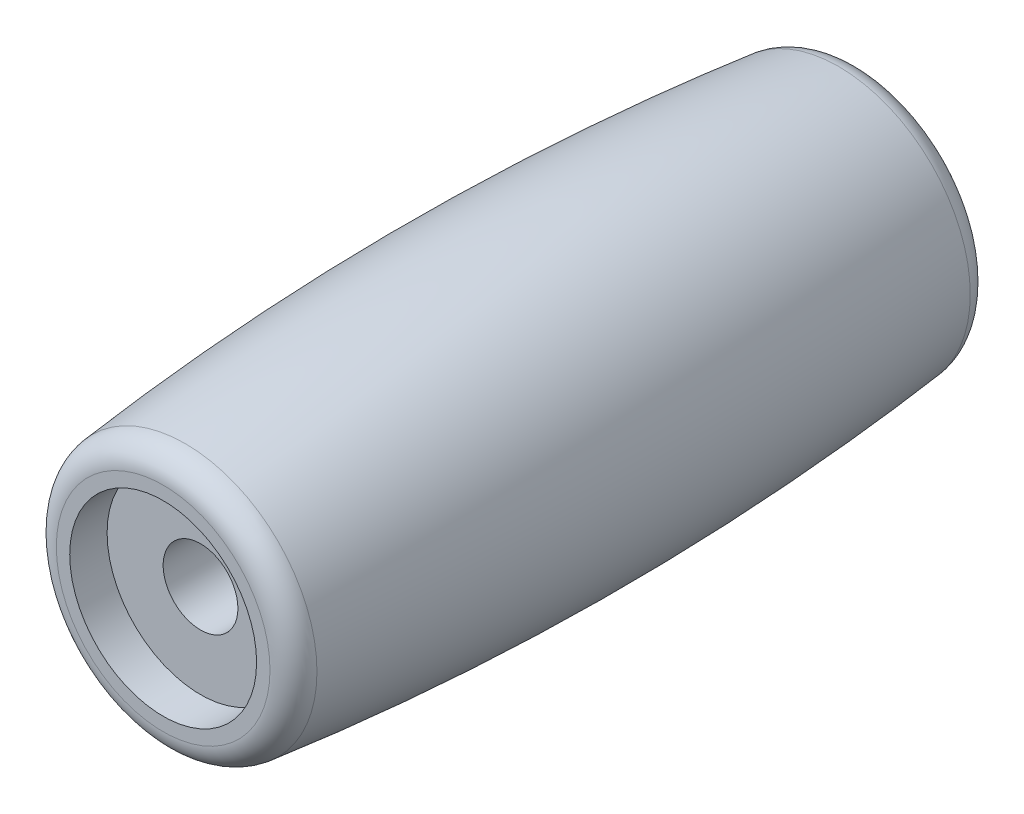
ISO-10303-21;
HEADER;
FILE_DESCRIPTION(('STEP AP214'),'2;1');
FILE_NAME('part.step','',(''),(''),'','','');
FILE_SCHEMA(('AUTOMOTIVE_DESIGN { 1 0 10303 214 1 1 1 1 }'));
ENDSEC;
DATA;
#1=APPLICATION_CONTEXT('core data for automotive mechanical design processes');
#2=APPLICATION_PROTOCOL_DEFINITION('international standard','automotive_design',2000,#1);
#3=PRODUCT_CONTEXT('',#1,'mechanical');
#4=PRODUCT('Part','Part','',(#3));
#5=PRODUCT_RELATED_PRODUCT_CATEGORY('part','',(#4));
#6=PRODUCT_DEFINITION_FORMATION('','',#4);
#7=PRODUCT_DEFINITION_CONTEXT('part definition',#1,'design');
#8=PRODUCT_DEFINITION('design','',#6,#7);
#9=PRODUCT_DEFINITION_SHAPE('','',#8);
#10=(LENGTH_UNIT() NAMED_UNIT(*) SI_UNIT(.MILLI.,.METRE.));
#11=(NAMED_UNIT(*) PLANE_ANGLE_UNIT() SI_UNIT($,.RADIAN.));
#12=(NAMED_UNIT(*) SI_UNIT($,.STERADIAN.) SOLID_ANGLE_UNIT());
#13=UNCERTAINTY_MEASURE_WITH_UNIT(LENGTH_MEASURE(1.E-05),#10,'distance_accuracy_value','');
#14=(GEOMETRIC_REPRESENTATION_CONTEXT(3) GLOBAL_UNCERTAINTY_ASSIGNED_CONTEXT((#13)) GLOBAL_UNIT_ASSIGNED_CONTEXT((#10,
#11,#12)) REPRESENTATION_CONTEXT('',''));
#15=CARTESIAN_POINT('',(0.,0.,0.));
#16=DIRECTION('',(0.,0.,1.));
#17=DIRECTION('',(1.,0.,0.));
#18=AXIS2_PLACEMENT_3D('',#15,#16,#17);
#19=CARTESIAN_POINT('',(0.,1.5,-16.3519380025075));
#20=DIRECTION('',(0.,0.,1.));
#21=DIRECTION('',(1.,0.,0.));
#22=AXIS2_PLACEMENT_3D('',#19,#20,#21);
#23=PLANE('',#22);
#24=CARTESIAN_POINT('',(0.,0.,-16.3519380025075));
#25=DIRECTION('',(0.,0.,1.));
#26=DIRECTION('',(1.,0.,0.));
#27=AXIS2_PLACEMENT_3D('',#24,#25,#26);
#28=CIRCLE('',#27,3.75);
#29=CARTESIAN_POINT('',(3.75,0.,-16.3519380025075));
#30=VERTEX_POINT('',#29);
#31=EDGE_CURVE('E10',#30,#30,#28,.T.);
#32=ORIENTED_EDGE('',*,*,#31,.F.);
#33=EDGE_LOOP('',(#32));
#34=FACE_BOUND('',#33,.T.);
#35=CARTESIAN_POINT('',(0.,0.,-16.3519380025075));
#36=DIRECTION('',(0.,0.,1.));
#37=DIRECTION('',(1.,0.,0.));
#38=AXIS2_PLACEMENT_3D('',#35,#36,#37);
#39=CIRCLE('',#38,1.5);
#40=CARTESIAN_POINT('',(1.5,0.,-16.3519380025075));
#41=VERTEX_POINT('',#40);
#42=EDGE_CURVE('E66',#41,#41,#39,.T.);
#43=ORIENTED_EDGE('',*,*,#42,.T.);
#44=EDGE_LOOP('',(#43));
#45=FACE_BOUND('',#44,.T.);
#46=ADVANCED_FACE('F32',(#34,#45),#23,.F.);
#47=CARTESIAN_POINT('',(0.,0.,-3.85193800250748));
#48=DIRECTION('',(0.,0.,1.));
#49=DIRECTION('',(1.,0.,0.));
#50=AXIS2_PLACEMENT_3D('',#47,#48,#49);
#51=CYLINDRICAL_SURFACE('',#50,3.75);
#52=CARTESIAN_POINT('',(0.,0.,-17.8519380025075));
#53=DIRECTION('',(0.,0.,1.));
#54=DIRECTION('',(1.,0.,0.));
#55=AXIS2_PLACEMENT_3D('',#52,#53,#54);
#56=CIRCLE('',#55,3.75);
#57=CARTESIAN_POINT('',(3.75,0.,-17.8519380025075));
#58=VERTEX_POINT('',#57);
#59=EDGE_CURVE('E38',#58,#58,#56,.T.);
#60=ORIENTED_EDGE('',*,*,#59,.F.);
#61=EDGE_LOOP('',(#60));
#62=FACE_BOUND('',#61,.T.);
#63=ORIENTED_EDGE('',*,*,#31,.T.);
#64=EDGE_LOOP('',(#63));
#65=FACE_BOUND('',#64,.T.);
#66=ADVANCED_FACE('F115',(#62,#65),#51,.F.);
#67=CARTESIAN_POINT('',(0.,3.75,-17.8519380025075));
#68=DIRECTION('',(0.,0.,1.));
#69=DIRECTION('',(1.,0.,0.));
#70=AXIS2_PLACEMENT_3D('',#67,#68,#69);
#71=PLANE('',#70);
#72=CARTESIAN_POINT('',(0.,0.,-17.8519380025075));
#73=DIRECTION('',(0.,0.,1.));
#74=DIRECTION('',(1.,0.,0.));
#75=AXIS2_PLACEMENT_3D('',#72,#73,#74);
#76=CIRCLE('',#75,4.28778466096996);
#77=CARTESIAN_POINT('',(4.28778466096996,0.,-17.8519380025075));
#78=VERTEX_POINT('',#77);
#79=EDGE_CURVE('E42',#78,#78,#76,.T.);
#80=ORIENTED_EDGE('',*,*,#79,.F.);
#81=EDGE_LOOP('',(#80));
#82=FACE_BOUND('',#81,.T.);
#83=ORIENTED_EDGE('',*,*,#59,.T.);
#84=EDGE_LOOP('',(#83));
#85=FACE_BOUND('',#84,.T.);
#86=ADVANCED_FACE('F110',(#82,#85),#71,.F.);
#87=CARTESIAN_POINT('',(0.,0.,-16.8519380025075));
#88=DIRECTION('',(0.,0.,1.));
#89=DIRECTION('',(1.,0.,0.));
#90=AXIS2_PLACEMENT_3D('',#87,#88,#89);
#91=TOROIDAL_SURFACE('',#90,4.28778466096996,0.999999999999997);
#92=CARTESIAN_POINT('',(0.,0.,-16.9611816999864));
#93=DIRECTION('',(0.,0.,1.));
#94=DIRECTION('',(1.,0.,0.));
#95=AXIS2_PLACEMENT_3D('',#92,#93,#94);
#96=CIRCLE('',#95,5.28179965812058);
#97=CARTESIAN_POINT('',(5.28179965812058,0.,-16.9611816999864));
#98=VERTEX_POINT('',#97);
#99=EDGE_CURVE('E46',#98,#98,#96,.T.);
#100=ORIENTED_EDGE('',*,*,#99,.F.);
#101=EDGE_LOOP('',(#100));
#102=FACE_BOUND('',#101,.T.);
#103=ORIENTED_EDGE('',*,*,#79,.T.);
#104=EDGE_LOOP('',(#103));
#105=FACE_BOUND('',#104,.T.);
#106=ADVANCED_FACE('F104',(#102,#105),#91,.T.);
#107=CARTESIAN_POINT('',(0.,0.,-3.8519380025073));
#108=DIRECTION('',(0.,0.,1.));
#109=DIRECTION('',(1.,0.,0.));
#110=AXIS2_PLACEMENT_3D('',#107,#108,#109);
#111=DEGENERATE_TOROIDAL_SURFACE('',#110,114.,120.,.F.);
#112=CARTESIAN_POINT('',(0.,0.,9.25730569497183));
#113=DIRECTION('',(0.,0.,1.));
#114=DIRECTION('',(1.,0.,0.));
#115=AXIS2_PLACEMENT_3D('',#112,#113,#114);
#116=CIRCLE('',#115,5.28179965812017);
#117=CARTESIAN_POINT('',(5.28179965812017,0.,9.25730569497183));
#118=VERTEX_POINT('',#117);
#119=EDGE_CURVE('E51',#118,#118,#116,.T.);
#120=ORIENTED_EDGE('',*,*,#119,.F.);
#121=EDGE_LOOP('',(#120));
#122=FACE_BOUND('',#121,.T.);
#123=ORIENTED_EDGE('',*,*,#99,.T.);
#124=EDGE_LOOP('',(#123));
#125=FACE_BOUND('',#124,.T.);
#126=ADVANCED_FACE('F98',(#122,#125),#111,.F.);
#127=CARTESIAN_POINT('',(0.,0.,9.14806199749277));
#128=DIRECTION('',(0.,0.,1.));
#129=DIRECTION('',(1.,0.,0.));
#130=AXIS2_PLACEMENT_3D('',#127,#128,#129);
#131=TOROIDAL_SURFACE('',#130,4.28778466096917,0.999999999999997);
#132=CARTESIAN_POINT('',(0.,0.,10.1480619974928));
#133=DIRECTION('',(0.,0.,1.));
#134=DIRECTION('',(1.,0.,0.));
#135=AXIS2_PLACEMENT_3D('',#132,#133,#134);
#136=CIRCLE('',#135,4.28778466096911);
#137=CARTESIAN_POINT('',(4.28778466096911,0.,10.1480619974928));
#138=VERTEX_POINT('',#137);
#139=EDGE_CURVE('E54',#138,#138,#136,.T.);
#140=ORIENTED_EDGE('',*,*,#139,.F.);
#141=EDGE_LOOP('',(#140));
#142=FACE_BOUND('',#141,.T.);
#143=ORIENTED_EDGE('',*,*,#119,.T.);
#144=EDGE_LOOP('',(#143));
#145=FACE_BOUND('',#144,.T.);
#146=ADVANCED_FACE('F92',(#142,#145),#131,.T.);
#147=CARTESIAN_POINT('',(0.,3.74999999999915,10.1480619974928));
#148=DIRECTION('',(0.,0.,-1.));
#149=DIRECTION('',(-1.,0.,0.));
#150=AXIS2_PLACEMENT_3D('',#147,#148,#149);
#151=PLANE('',#150);
#152=CARTESIAN_POINT('',(0.,0.,10.1480619974927));
#153=DIRECTION('',(0.,0.,1.));
#154=DIRECTION('',(1.,0.,0.));
#155=AXIS2_PLACEMENT_3D('',#152,#153,#154);
#156=CIRCLE('',#155,3.74999999999915);
#157=CARTESIAN_POINT('',(3.74999999999915,0.,10.1480619974927));
#158=VERTEX_POINT('',#157);
#159=EDGE_CURVE('E57',#158,#158,#156,.T.);
#160=ORIENTED_EDGE('',*,*,#159,.F.);
#161=EDGE_LOOP('',(#160));
#162=FACE_BOUND('',#161,.T.);
#163=ORIENTED_EDGE('',*,*,#139,.T.);
#164=EDGE_LOOP('',(#163));
#165=FACE_BOUND('',#164,.T.);
#166=ADVANCED_FACE('F86',(#162,#165),#151,.F.);
#167=CARTESIAN_POINT('',(0.,0.,-3.85193800250748));
#168=DIRECTION('',(0.,0.,1.));
#169=DIRECTION('',(1.,0.,0.));
#170=AXIS2_PLACEMENT_3D('',#167,#168,#169);
#171=CYLINDRICAL_SURFACE('',#170,3.74999999999919);
#172=CARTESIAN_POINT('',(0.,0.,8.64806199749275));
#173=DIRECTION('',(0.,0.,1.));
#174=DIRECTION('',(1.,0.,0.));
#175=AXIS2_PLACEMENT_3D('',#172,#173,#174);
#176=CIRCLE('',#175,3.74999999999924);
#177=CARTESIAN_POINT('',(3.74999999999924,0.,8.64806199749275));
#178=VERTEX_POINT('',#177);
#179=EDGE_CURVE('E60',#178,#178,#176,.T.);
#180=ORIENTED_EDGE('',*,*,#179,.F.);
#181=EDGE_LOOP('',(#180));
#182=FACE_BOUND('',#181,.T.);
#183=ORIENTED_EDGE('',*,*,#159,.T.);
#184=EDGE_LOOP('',(#183));
#185=FACE_BOUND('',#184,.T.);
#186=ADVANCED_FACE('F80',(#182,#185),#171,.F.);
#187=CARTESIAN_POINT('',(0.,1.49999999999924,8.64806199749268));
#188=DIRECTION('',(0.,0.,-1.));
#189=DIRECTION('',(-1.,0.,0.));
#190=AXIS2_PLACEMENT_3D('',#187,#188,#189);
#191=PLANE('',#190);
#192=CARTESIAN_POINT('',(0.,0.,8.64806199749261));
#193=DIRECTION('',(0.,0.,1.));
#194=DIRECTION('',(1.,0.,0.));
#195=AXIS2_PLACEMENT_3D('',#192,#193,#194);
#196=CIRCLE('',#195,1.49999999999924);
#197=CARTESIAN_POINT('',(1.49999999999924,0.,8.64806199749261));
#198=VERTEX_POINT('',#197);
#199=EDGE_CURVE('E63',#198,#198,#196,.T.);
#200=ORIENTED_EDGE('',*,*,#199,.F.);
#201=EDGE_LOOP('',(#200));
#202=FACE_BOUND('',#201,.T.);
#203=ORIENTED_EDGE('',*,*,#179,.T.);
#204=EDGE_LOOP('',(#203));
#205=FACE_BOUND('',#204,.T.);
#206=ADVANCED_FACE('F74',(#202,#205),#191,.F.);
#207=CARTESIAN_POINT('',(0.,0.,-3.85193800250748));
#208=DIRECTION('',(0.,0.,1.));
#209=DIRECTION('',(1.,0.,0.));
#210=AXIS2_PLACEMENT_3D('',#207,#208,#209);
#211=CYLINDRICAL_SURFACE('',#210,1.49999999999962);
#212=ORIENTED_EDGE('',*,*,#42,.F.);
#213=EDGE_LOOP('',(#212));
#214=FACE_BOUND('',#213,.T.);
#215=ORIENTED_EDGE('',*,*,#199,.T.);
#216=EDGE_LOOP('',(#215));
#217=FACE_BOUND('',#216,.T.);
#218=ADVANCED_FACE('F71',(#214,#217),#211,.F.);
#219=CLOSED_SHELL('',(#46,#66,#86,#106,#126,#146,#166,#186,#206,#218));
#220=MANIFOLD_SOLID_BREP('B2',#219);
#221=ADVANCED_BREP_SHAPE_REPRESENTATION('',(#18,#220),#14);
#222=SHAPE_DEFINITION_REPRESENTATION(#9,#221);
ENDSEC;
END-ISO-10303-21;
